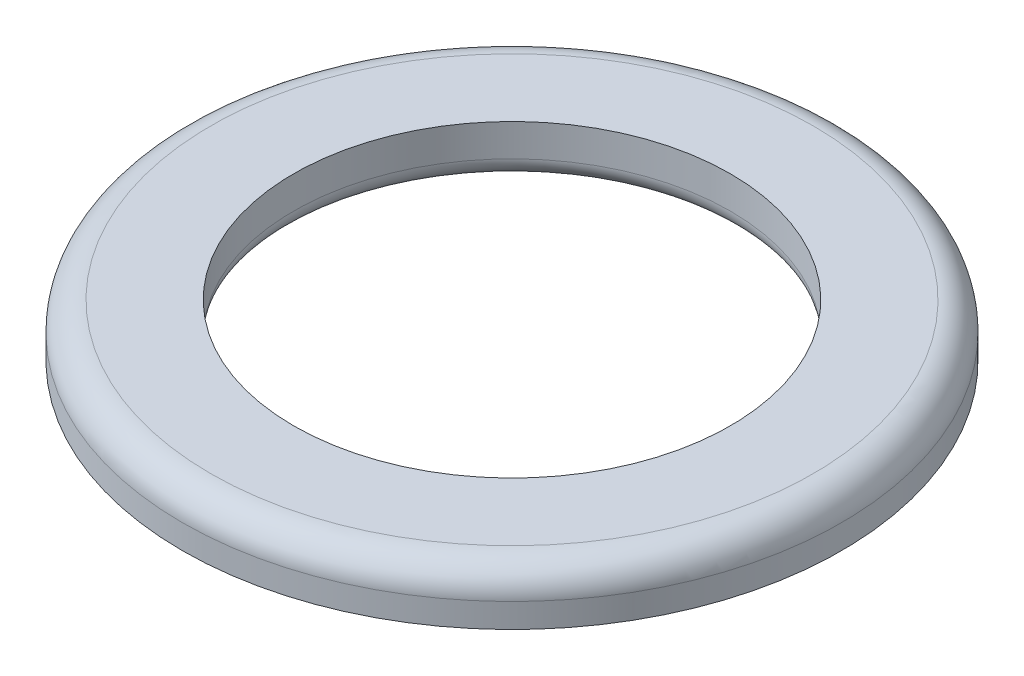
ISO-10303-21;
HEADER;
FILE_DESCRIPTION(('STEP AP214'),'2;1');
FILE_NAME('part.step','',(''),(''),'','','');
FILE_SCHEMA(('AUTOMOTIVE_DESIGN { 1 0 10303 214 1 1 1 1 }'));
ENDSEC;
DATA;
#1=APPLICATION_CONTEXT('core data for automotive mechanical design processes');
#2=APPLICATION_PROTOCOL_DEFINITION('international standard','automotive_design',2000,#1);
#3=PRODUCT_CONTEXT('',#1,'mechanical');
#4=PRODUCT('Part','Part','',(#3));
#5=PRODUCT_RELATED_PRODUCT_CATEGORY('part','',(#4));
#6=PRODUCT_DEFINITION_FORMATION('','',#4);
#7=PRODUCT_DEFINITION_CONTEXT('part definition',#1,'design');
#8=PRODUCT_DEFINITION('design','',#6,#7);
#9=PRODUCT_DEFINITION_SHAPE('','',#8);
#10=(LENGTH_UNIT() NAMED_UNIT(*) SI_UNIT(.MILLI.,.METRE.));
#11=(NAMED_UNIT(*) PLANE_ANGLE_UNIT() SI_UNIT($,.RADIAN.));
#12=(NAMED_UNIT(*) SI_UNIT($,.STERADIAN.) SOLID_ANGLE_UNIT());
#13=UNCERTAINTY_MEASURE_WITH_UNIT(LENGTH_MEASURE(1.E-05),#10,'distance_accuracy_value','');
#14=(GEOMETRIC_REPRESENTATION_CONTEXT(3) GLOBAL_UNCERTAINTY_ASSIGNED_CONTEXT((#13)) GLOBAL_UNIT_ASSIGNED_CONTEXT((#10,
#11,#12)) REPRESENTATION_CONTEXT('',''));
#15=CARTESIAN_POINT('',(0.,0.,0.));
#16=DIRECTION('',(0.,0.,1.));
#17=DIRECTION('',(1.,0.,0.));
#18=AXIS2_PLACEMENT_3D('',#15,#16,#17);
#19=CARTESIAN_POINT('',(0.,1.3,0.));
#20=DIRECTION('',(0.,1.,0.));
#21=DIRECTION('',(0.,0.,1.));
#22=AXIS2_PLACEMENT_3D('',#19,#20,#21);
#23=PLANE('',#22);
#24=CARTESIAN_POINT('',(0.,1.3,0.));
#25=DIRECTION('',(0.,1.,0.));
#26=DIRECTION('',(0.,0.,1.));
#27=AXIS2_PLACEMENT_3D('',#24,#25,#26);
#28=CIRCLE('',#27,7.45);
#29=CARTESIAN_POINT('',(0.,1.3,7.45));
#30=VERTEX_POINT('',#29);
#31=EDGE_CURVE('E55',#30,#30,#28,.T.);
#32=ORIENTED_EDGE('',*,*,#31,.T.);
#33=EDGE_LOOP('',(#32));
#34=FACE_BOUND('',#33,.T.);
#35=CARTESIAN_POINT('',(0.,1.3,0.));
#36=DIRECTION('',(0.,1.,0.));
#37=DIRECTION('',(0.,0.,1.));
#38=AXIS2_PLACEMENT_3D('',#35,#36,#37);
#39=CIRCLE('',#38,5.4);
#40=CARTESIAN_POINT('',(0.,1.3,5.4));
#41=VERTEX_POINT('',#40);
#42=EDGE_CURVE('E65',#41,#41,#39,.T.);
#43=ORIENTED_EDGE('',*,*,#42,.F.);
#44=EDGE_LOOP('',(#43));
#45=FACE_BOUND('',#44,.T.);
#46=ADVANCED_FACE('F37',(#34,#45),#23,.T.);
#47=CARTESIAN_POINT('',(0.,0.,0.));
#48=DIRECTION('',(0.,1.,0.));
#49=DIRECTION('',(0.,0.,1.));
#50=AXIS2_PLACEMENT_3D('',#47,#48,#49);
#51=PLANE('',#50);
#52=CARTESIAN_POINT('',(0.,0.,0.));
#53=DIRECTION('',(0.,1.,0.));
#54=DIRECTION('',(0.,0.,1.));
#55=AXIS2_PLACEMENT_3D('',#52,#53,#54);
#56=CIRCLE('',#55,5.9);
#57=CARTESIAN_POINT('',(0.,0.,5.9));
#58=VERTEX_POINT('',#57);
#59=EDGE_CURVE('E45',#58,#58,#56,.T.);
#60=ORIENTED_EDGE('',*,*,#59,.T.);
#61=EDGE_LOOP('',(#60));
#62=FACE_BOUND('',#61,.T.);
#63=CARTESIAN_POINT('',(0.,0.,0.));
#64=DIRECTION('',(0.,1.,0.));
#65=DIRECTION('',(0.,0.,1.));
#66=AXIS2_PLACEMENT_3D('',#63,#64,#65);
#67=CIRCLE('',#66,8.15);
#68=CARTESIAN_POINT('',(0.,0.,8.15));
#69=VERTEX_POINT('',#68);
#70=EDGE_CURVE('E61',#69,#69,#67,.T.);
#71=ORIENTED_EDGE('',*,*,#70,.F.);
#72=EDGE_LOOP('',(#71));
#73=FACE_BOUND('',#72,.T.);
#74=ADVANCED_FACE('F73',(#62,#73),#51,.F.);
#75=CARTESIAN_POINT('',(0.,1.3,0.));
#76=DIRECTION('',(0.,-1.,0.));
#77=DIRECTION('',(0.,0.,-1.));
#78=AXIS2_PLACEMENT_3D('',#75,#76,#77);
#79=CYLINDRICAL_SURFACE('',#78,8.15);
#80=CARTESIAN_POINT('',(0.,0.6,0.));
#81=DIRECTION('',(0.,1.,0.));
#82=DIRECTION('',(0.,0.,1.));
#83=AXIS2_PLACEMENT_3D('',#80,#81,#82);
#84=CIRCLE('',#83,8.15);
#85=CARTESIAN_POINT('',(0.,0.6,8.15));
#86=VERTEX_POINT('',#85);
#87=EDGE_CURVE('E50',#86,#86,#84,.F.);
#88=ORIENTED_EDGE('',*,*,#87,.T.);
#89=EDGE_LOOP('',(#88));
#90=FACE_BOUND('',#89,.T.);
#91=ORIENTED_EDGE('',*,*,#70,.T.);
#92=EDGE_LOOP('',(#91));
#93=FACE_BOUND('',#92,.T.);
#94=ADVANCED_FACE('F79',(#90,#93),#79,.T.);
#95=CARTESIAN_POINT('',(0.,1.3,0.));
#96=DIRECTION('',(0.,-1.,0.));
#97=DIRECTION('',(0.,0.,-1.));
#98=AXIS2_PLACEMENT_3D('',#95,#96,#97);
#99=CYLINDRICAL_SURFACE('',#98,5.4);
#100=CARTESIAN_POINT('',(0.,0.5,0.));
#101=DIRECTION('',(0.,1.,0.));
#102=DIRECTION('',(0.,0.,1.));
#103=AXIS2_PLACEMENT_3D('',#100,#101,#102);
#104=CIRCLE('',#103,5.4);
#105=CARTESIAN_POINT('',(0.,0.5,5.4));
#106=VERTEX_POINT('',#105);
#107=EDGE_CURVE('E10',#106,#106,#104,.F.);
#108=ORIENTED_EDGE('',*,*,#107,.T.);
#109=EDGE_LOOP('',(#108));
#110=FACE_BOUND('',#109,.T.);
#111=ORIENTED_EDGE('',*,*,#42,.T.);
#112=EDGE_LOOP('',(#111));
#113=FACE_BOUND('',#112,.T.);
#114=ADVANCED_FACE('F70',(#110,#113),#99,.F.);
#115=CARTESIAN_POINT('',(0.,0.6,0.));
#116=DIRECTION('',(0.,1.,0.));
#117=DIRECTION('',(0.,0.,1.));
#118=AXIS2_PLACEMENT_3D('',#115,#116,#117);
#119=TOROIDAL_SURFACE('',#118,7.45,0.7);
#120=ORIENTED_EDGE('',*,*,#87,.F.);
#121=EDGE_LOOP('',(#120));
#122=FACE_BOUND('',#121,.T.);
#123=ORIENTED_EDGE('',*,*,#31,.F.);
#124=EDGE_LOOP('',(#123));
#125=FACE_BOUND('',#124,.T.);
#126=ADVANCED_FACE('F85',(#122,#125),#119,.T.);
#127=CARTESIAN_POINT('',(0.,0.5,0.));
#128=DIRECTION('',(0.,1.,0.));
#129=DIRECTION('',(0.,0.,1.));
#130=AXIS2_PLACEMENT_3D('',#127,#128,#129);
#131=TOROIDAL_SURFACE('',#130,5.9,0.5);
#132=ORIENTED_EDGE('',*,*,#107,.F.);
#133=EDGE_LOOP('',(#132));
#134=FACE_BOUND('',#133,.T.);
#135=ORIENTED_EDGE('',*,*,#59,.F.);
#136=EDGE_LOOP('',(#135));
#137=FACE_BOUND('',#136,.T.);
#138=ADVANCED_FACE('F39',(#134,#137),#131,.T.);
#139=CLOSED_SHELL('',(#46,#74,#94,#114,#126,#138));
#140=MANIFOLD_SOLID_BREP('B2',#139);
#141=ADVANCED_BREP_SHAPE_REPRESENTATION('',(#18,#140),#14);
#142=SHAPE_DEFINITION_REPRESENTATION(#9,#141);
ENDSEC;
END-ISO-10303-21;
